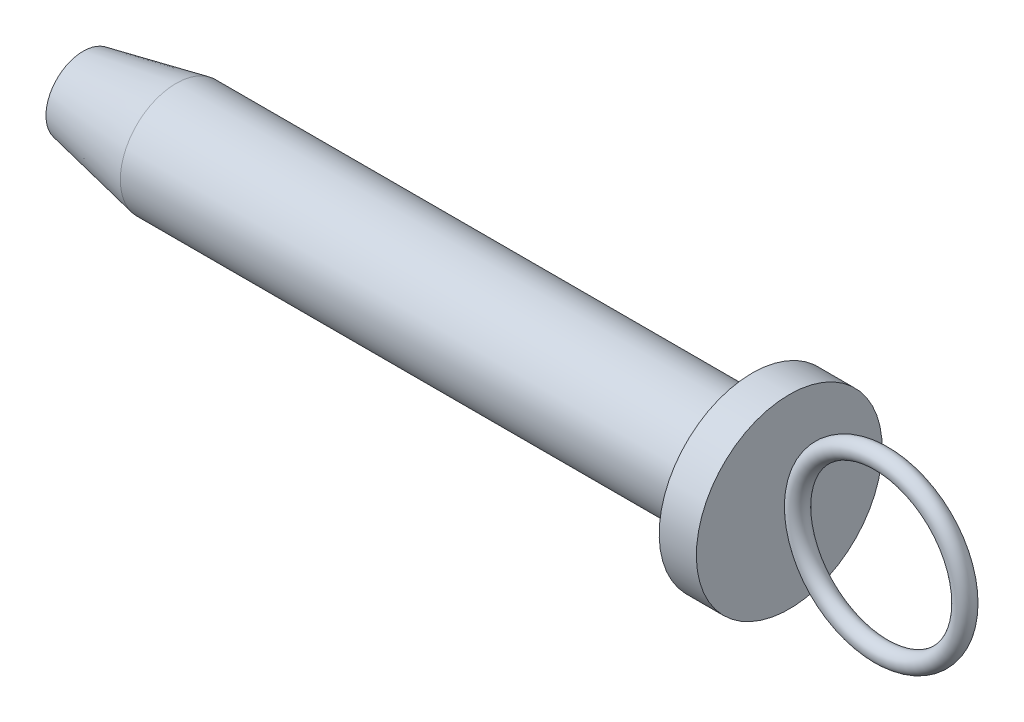
ISO-10303-21;
HEADER;
FILE_DESCRIPTION(('STEP AP214'),'2;1');
FILE_NAME('part.step','',(''),(''),'','','');
FILE_SCHEMA(('AUTOMOTIVE_DESIGN { 1 0 10303 214 1 1 1 1 }'));
ENDSEC;
DATA;
#1=APPLICATION_CONTEXT('core data for automotive mechanical design processes');
#2=APPLICATION_PROTOCOL_DEFINITION('international standard','automotive_design',2000,#1);
#3=PRODUCT_CONTEXT('',#1,'mechanical');
#4=PRODUCT('Part','Part','',(#3));
#5=PRODUCT_RELATED_PRODUCT_CATEGORY('part','',(#4));
#6=PRODUCT_DEFINITION_FORMATION('','',#4);
#7=PRODUCT_DEFINITION_CONTEXT('part definition',#1,'design');
#8=PRODUCT_DEFINITION('design','',#6,#7);
#9=PRODUCT_DEFINITION_SHAPE('','',#8);
#10=(LENGTH_UNIT() NAMED_UNIT(*) SI_UNIT(.MILLI.,.METRE.));
#11=(NAMED_UNIT(*) PLANE_ANGLE_UNIT() SI_UNIT($,.RADIAN.));
#12=(NAMED_UNIT(*) SI_UNIT($,.STERADIAN.) SOLID_ANGLE_UNIT());
#13=UNCERTAINTY_MEASURE_WITH_UNIT(LENGTH_MEASURE(1.E-05),#10,'distance_accuracy_value','');
#14=(GEOMETRIC_REPRESENTATION_CONTEXT(3) GLOBAL_UNCERTAINTY_ASSIGNED_CONTEXT((#13)) GLOBAL_UNIT_ASSIGNED_CONTEXT((#10,
#11,#12)) REPRESENTATION_CONTEXT('',''));
#15=CARTESIAN_POINT('',(0.,0.,0.));
#16=DIRECTION('',(0.,0.,1.));
#17=DIRECTION('',(1.,0.,0.));
#18=AXIS2_PLACEMENT_3D('',#15,#16,#17);
#19=CARTESIAN_POINT('',(0.,0.,0.));
#20=DIRECTION('',(1.,0.,0.));
#21=DIRECTION('',(0.,1.,0.));
#22=AXIS2_PLACEMENT_3D('',#19,#20,#21);
#23=PLANE('',#22);
#24=CARTESIAN_POINT('',(0.,0.,0.));
#25=DIRECTION('',(1.,0.,0.));
#26=DIRECTION('',(0.,1.,0.));
#27=AXIS2_PLACEMENT_3D('',#24,#25,#26);
#28=CIRCLE('',#27,50.);
#29=CARTESIAN_POINT('',(0.,50.,0.));
#30=VERTEX_POINT('',#29);
#31=EDGE_CURVE('E10',#30,#30,#28,.T.);
#32=ORIENTED_EDGE('',*,*,#31,.T.);
#33=EDGE_LOOP('',(#32));
#34=FACE_BOUND('',#33,.T.);
#35=CARTESIAN_POINT('',(0.,0.,2.17944947177033));
#36=CARTESIAN_POINT('',(0.,0.42149878183856,2.17945998659477));
#37=CARTESIAN_POINT('',(0.,0.843027722689126,2.16841904708334));
#38=CARTESIAN_POINT('',(0.,1.68536396219885,2.12318815262287));
#39=CARTESIAN_POINT('',(0.,2.10617001058888,2.08897350495459));
#40=CARTESIAN_POINT('',(0.,2.73471753888769,2.01732833882473));
#41=CARTESIAN_POINT('',(0.,2.94363657789298,1.99008700078861));
#42=CARTESIAN_POINT('',(0.,3.36031705389396,1.92791519862246));
#43=CARTESIAN_POINT('',(0.,3.56807865726714,1.89298587047071));
#44=CARTESIAN_POINT('',(0.,3.9815491142398,1.81421682686651));
#45=CARTESIAN_POINT('',(0.,4.18726089346198,1.77039260504047));
#46=CARTESIAN_POINT('',(0.,4.59603124982678,1.67187975849132));
#47=CARTESIAN_POINT('',(0.,4.79909112998843,1.61719670115698));
#48=CARTESIAN_POINT('',(0.,5.11320466515671,1.52074350807588));
#49=CARTESIAN_POINT('',(0.,5.22572640550955,1.48375706519663));
#50=CARTESIAN_POINT('',(0.,5.44895853441453,1.40443549967379));
#51=CARTESIAN_POINT('',(0.,5.55966794843453,1.36209759965095));
#52=CARTESIAN_POINT('',(0.,5.77845963931046,1.27089103021431));
#53=CARTESIAN_POINT('',(0.,5.8865405251225,1.22201898808466));
#54=CARTESIAN_POINT('',(0.,6.09854862533586,1.11606179693367));
#55=CARTESIAN_POINT('',(0.,6.20248043772922,1.05898608133228));
#56=CARTESIAN_POINT('',(0.,6.40481313003735,0.933359937281019));
#57=CARTESIAN_POINT('',(0.,6.50314189395607,0.864691897900993));
#58=CARTESIAN_POINT('',(0.,6.68726313431992,0.712402419432671));
#59=CARTESIAN_POINT('',(0.,6.77314883497989,0.628903871459761));
#60=CARTESIAN_POINT('',(0.,6.8757787162716,0.498268042379382));
#61=CARTESIAN_POINT('',(0.,6.90303278061325,0.45947898442415));
#62=CARTESIAN_POINT('',(0.,6.95214613324469,0.378547324332877));
#63=CARTESIAN_POINT('',(0.,6.97400491584688,0.336404408336449));
#64=CARTESIAN_POINT('',(0.,7.01083808281939,0.24853394838752));
#65=CARTESIAN_POINT('',(0.,7.0257268979002,0.202769523901598));
#66=CARTESIAN_POINT('',(0.,7.04645295226523,0.109246754611275));
#67=CARTESIAN_POINT('',(0.,7.05230659797149,0.061492185979087));
#68=CARTESIAN_POINT('',(0.,7.05406930243933,-0.0292543239346663));
#69=CARTESIAN_POINT('',(0.,7.0509420613236,-0.072229309776161));
#70=CARTESIAN_POINT('',(0.,7.03716162438825,-0.15695895660505));
#71=CARTESIAN_POINT('',(0.,7.02650140314884,-0.198712440508724));
#72=CARTESIAN_POINT('',(0.,6.99535927964785,-0.289871458175785));
#73=CARTESIAN_POINT('',(0.,6.97311887355608,-0.338667362862952));
#74=CARTESIAN_POINT('',(0.,6.92117709628851,-0.432083951970965));
#75=CARTESIAN_POINT('',(0.,6.89146055486769,-0.476695890687562));
#76=CARTESIAN_POINT('',(0.,6.80485532696441,-0.590572331510381));
#77=CARTESIAN_POINT('',(0.,6.74316841758978,-0.656141724988561));
#78=CARTESIAN_POINT('',(0.,6.61121393622031,-0.777885124418113));
#79=CARTESIAN_POINT('',(0.,6.54092138014418,-0.834030595690454));
#80=CARTESIAN_POINT('',(0.,6.36868536131937,-0.957917873318232));
#81=CARTESIAN_POINT('',(0.,6.26449637346105,-1.02249899099252));
#82=CARTESIAN_POINT('',(0.,6.0504723175763,-1.14166535105351));
#83=CARTESIAN_POINT('',(0.,5.94062622347301,-1.1962300476875));
#84=CARTESIAN_POINT('',(0.,5.71691063613275,-1.29782453209946));
#85=CARTESIAN_POINT('',(0.,5.60302446944741,-1.34481718787084));
#86=CARTESIAN_POINT('',(0.,5.37300224226769,-1.43248201978746));
#87=CARTESIAN_POINT('',(0.,5.25686835672187,-1.47315999292818));
#88=CARTESIAN_POINT('',(0.,4.95344797587697,-1.57200493234357));
#89=CARTESIAN_POINT('',(0.,4.76487364590706,-1.62620743035004));
#90=CARTESIAN_POINT('',(0.,4.38507011567415,-1.72448075127132));
#91=CARTESIAN_POINT('',(0.,4.19383962017605,-1.76854643305016));
#92=CARTESIAN_POINT('',(0.,3.80930747760474,-1.84841620213058));
#93=CARTESIAN_POINT('',(0.,3.61600265523733,-1.88420486609413));
#94=CARTESIAN_POINT('',(0.,3.22819781392611,-1.94865007485328));
#95=CARTESIAN_POINT('',(0.,3.03369761839277,-1.97730553860021));
#96=CARTESIAN_POINT('',(0.,2.44780338105798,-2.05406713367449));
#97=CARTESIAN_POINT('',(0.,2.05515848590833,-2.09274358527696));
#98=CARTESIAN_POINT('',(0.,1.26892169615385,-2.14903314060557));
#99=CARTESIAN_POINT('',(0.,0.875331464804734,-2.16667103490342));
#100=CARTESIAN_POINT('',(0.,0.0355100722776041,-2.18359538728171));
#101=CARTESIAN_POINT('',(0.,-0.410777411562641,-2.18013678180801));
#102=CARTESIAN_POINT('',(0.,-1.30304763369249,-2.14800165032402));
#103=CARTESIAN_POINT('',(0.,-1.74902937985356,-2.11929516613826));
#104=CARTESIAN_POINT('',(0.,-2.41467249606519,-2.05469940727802));
#105=CARTESIAN_POINT('',(0.,-2.63541038360809,-2.02967394396318));
#106=CARTESIAN_POINT('',(0.,-3.07581583397932,-1.97158676878631));
#107=CARTESIAN_POINT('',(0.,-3.29548354427478,-1.93852619803324));
#108=CARTESIAN_POINT('',(0.,-3.73286882380672,-1.86316489118027));
#109=CARTESIAN_POINT('',(0.,-3.95058901460545,-1.82087950567084));
#110=CARTESIAN_POINT('',(0.,-4.38352365652223,-1.72513406489578));
#111=CARTESIAN_POINT('',(0.,-4.5987392380628,-1.6716792750586));
#112=CARTESIAN_POINT('',(0.,-4.93242244589615,-1.57680841630995));
#113=CARTESIAN_POINT('',(0.,-5.05227430378716,-1.54026170895099));
#114=CARTESIAN_POINT('',(0.,-5.29025594647154,-1.46169632013567));
#115=CARTESIAN_POINT('',(0.,-5.40838489898437,-1.4196750855039));
#116=CARTESIAN_POINT('',(0.,-5.6422119188477,-1.32894553586474));
#117=CARTESIAN_POINT('',(0.,-5.75790737835958,-1.28023043032896));
#118=CARTESIAN_POINT('',(0.,-5.98535646460333,-1.17442480556571));
#119=CARTESIAN_POINT('',(0.,-6.09711402125455,-1.11734294769992));
#120=CARTESIAN_POINT('',(0.,-6.31534981053315,-0.991578699532659));
#121=CARTESIAN_POINT('',(0.,-6.42176976259173,-0.922794054102972));
#122=CARTESIAN_POINT('',(0.,-6.62277815714594,-0.769906612766153));
#123=CARTESIAN_POINT('',(0.,-6.71744707452865,-0.685918949242545));
#124=CARTESIAN_POINT('',(0.,-6.83259199612223,-0.554244909761135));
#125=CARTESIAN_POINT('',(0.,-6.86319645284333,-0.515510667955197));
#126=CARTESIAN_POINT('',(0.,-6.91932485823459,-0.434421020387249));
#127=CARTESIAN_POINT('',(0.,-6.94484634796394,-0.392063876101051));
#128=CARTESIAN_POINT('',(0.,-6.98928518334076,-0.303256767548711));
#129=CARTESIAN_POINT('',(0.,-7.00811546072234,-0.25676204012301));
#130=CARTESIAN_POINT('',(0.,-7.03658525286622,-0.161053281266286));
#131=CARTESIAN_POINT('',(0.,-7.04624588755985,-0.111845776224539));
#132=CARTESIAN_POINT('',(0.,-7.05458669702452,-0.01728240125677));
#133=CARTESIAN_POINT('',(0.,-7.05423613779896,0.02798715789848));
#134=CARTESIAN_POINT('',(0.,-7.04497970483613,0.117650334713045));
#135=CARTESIAN_POINT('',(0.,-7.03606695035198,0.162043218575106));
#136=CARTESIAN_POINT('',(0.,-7.00913534044537,0.254122307034996));
#137=CARTESIAN_POINT('',(0.,-6.99009808678667,0.301504089437999));
#138=CARTESIAN_POINT('',(0.,-6.94465769341792,0.392567053069191));
#139=CARTESIAN_POINT('',(0.,-6.91824161676512,0.436241557537717));
#140=CARTESIAN_POINT('',(0.,-6.84211815750932,0.545524279312061));
#141=CARTESIAN_POINT('',(0.,-6.7880843221241,0.608080577602883));
#142=CARTESIAN_POINT('',(0.,-6.67163798663171,0.724744813787047));
#143=CARTESIAN_POINT('',(0.,-6.60920237227783,0.778828521263772));
#144=CARTESIAN_POINT('',(0.,-6.45970866169796,0.89530045457902));
#145=CARTESIAN_POINT('',(0.,-6.37085872507568,0.955358435834267));
#146=CARTESIAN_POINT('',(0.,-6.18785193917911,1.06688305517149));
#147=CARTESIAN_POINT('',(0.,-6.09368529018751,1.11833308662321));
#148=CARTESIAN_POINT('',(0.,-5.90148662885084,1.21470068123799));
#149=CARTESIAN_POINT('',(0.,-5.80343695173868,1.25958261175952));
#150=CARTESIAN_POINT('',(0.,-5.60510795366906,1.34378051469834));
#151=CARTESIAN_POINT('',(0.,-5.50483061170207,1.38310121541691));
#152=CARTESIAN_POINT('',(0.,-5.24427436420939,1.47856605905192));
#153=CARTESIAN_POINT('',(0.,-5.0827593113308,1.5313265727075));
#154=CARTESIAN_POINT('',(0.,-4.75708536476196,1.62804561156496));
#155=CARTESIAN_POINT('',(0.,-4.59292514748774,1.67199957243182));
#156=CARTESIAN_POINT('',(0.,-4.26255226726789,1.75275184318911));
#157=CARTESIAN_POINT('',(0.,-4.09633641566277,1.78953699942011));
#158=CARTESIAN_POINT('',(0.,-3.76265354985,1.85695917294306));
#159=CARTESIAN_POINT('',(0.,-3.59518634810483,1.88759524870568));
#160=CARTESIAN_POINT('',(0.,-3.09173815919111,1.97146155174675));
#161=CARTESIAN_POINT('',(0.,-2.75442000828965,2.01671741415881));
#162=CARTESIAN_POINT('',(0.,-2.07833897486486,2.08987891962339));
#163=CARTESIAN_POINT('',(0.,-1.73957793284239,2.11780234154776));
#164=CARTESIAN_POINT('',(0.,-1.167276062117,2.15200686118283));
#165=CARTESIAN_POINT('',(0.,-0.933967456387854,2.16232552057151));
#166=CARTESIAN_POINT('',(0.,-0.467109010978816,2.17604453260486));
#167=CARTESIAN_POINT('',(0.,-0.233559135566106,2.17944364533994));
#168=CARTESIAN_POINT('',(0.,0.,2.17944947177033));
#169=B_SPLINE_CURVE_WITH_KNOTS('',3,(#35,#36,#37,#38,#39,#40,#41,#42,#43,#44,#45,#46,#47,#48,
#49,#50,#51,#52,#53,#54,#55,#56,#57,#58,#59,#60,#61,#62,#63,#64,#65,#66,#67,#68,#69,#70,#71,#72,
#73,#74,#75,#76,#77,#78,#79,#80,#81,#82,#83,#84,#85,#86,#87,#88,#89,#90,#91,#92,#93,#94,#95,#96,
#97,#98,#99,#100,#101,#102,#103,#104,#105,#106,#107,#108,#109,#110,#111,#112,#113,#114,#115,
#116,#117,#118,#119,#120,#121,#122,#123,#124,#125,#126,#127,#128,#129,#130,#131,#132,#133,#134,
#135,#136,#137,#138,#139,#140,#141,#142,#143,#144,#145,#146,#147,#148,#149,#150,#151,#152,#153,
#154,#155,#156,#157,#158,#159,#160,#161,#162,#163,#164,#165,#166,#167,#168),.UNSPECIFIED.,.T.,
.F.,(4,2,2,2,2,2,2,2,2,2,2,2,2,2,2,2,2,2,2,2,2,2,2,2,2,2,2,2,2,2,2,2,2,2,2,2,2,2,2,2,2,2,2,2,2,
2,2,2,2,2,2,2,2,2,2,2,2,2,2,2,2,2,2,2,2,2,4),(0.,1.26441863343538,2.5301866907775,
3.16213858340576,3.79399716136293,4.42476443491072,5.05520914148919,5.41044125196759,
5.76585848899681,6.12145989448238,6.47665561688514,6.83569929330721,7.19189592183801,
7.33378713970543,7.47569165167126,7.61929535633629,7.76263799159498,7.89119158031978,
8.01986521939751,8.1798429188074,8.3401478937655,8.60870050608162,8.8780521467,9.24491867464901,
9.61252951225128,9.98189152543646,10.3509124262644,10.939135055324,11.5276553614474,
12.1172636319069,12.7069612041785,13.8898434457294,15.071330468632,16.4095616881391,
17.749382947544,18.4157249508587,19.0819723785898,19.7471194782951,20.4119537220435,
20.787754445286,21.163731063733,21.5400919429709,21.9160659252196,22.2955117580467,
22.6721959047942,22.8199929083666,22.9678612376089,23.1175887136578,23.2669704878172,
23.4019432479989,23.537024565733,23.6893734133344,23.8419910618698,24.0885758346499,
24.3358534146157,24.6568418383956,24.9784425519177,25.3017279899105,25.6247368882881,
26.1341191362447,26.6437647120882,27.1543367826725,27.6649869710313,28.685394150744,
29.7047529034348,30.4052617359112,31.1058960811179),.UNSPECIFIED.);
#170=CARTESIAN_POINT('',(0.,0.,2.17944947177033));
#171=VERTEX_POINT('',#170);
#172=EDGE_CURVE('E36',#171,#171,#169,.T.);
#173=ORIENTED_EDGE('',*,*,#172,.T.);
#174=EDGE_LOOP('',(#173));
#175=FACE_BOUND('',#174,.T.);
#176=ADVANCED_FACE('F32',(#34,#175),#23,.T.);
#177=CARTESIAN_POINT('',(0.,0.,0.));
#178=DIRECTION('',(1.,0.,0.));
#179=DIRECTION('',(0.,1.,0.));
#180=AXIS2_PLACEMENT_3D('',#177,#178,#179);
#181=CYLINDRICAL_SURFACE('',#180,50.);
#182=CARTESIAN_POINT('',(-20.,0.,0.));
#183=DIRECTION('',(1.,0.,0.));
#184=DIRECTION('',(0.,1.,0.));
#185=AXIS2_PLACEMENT_3D('',#182,#183,#184);
#186=CIRCLE('',#185,50.);
#187=CARTESIAN_POINT('',(-20.,50.,0.));
#188=VERTEX_POINT('',#187);
#189=EDGE_CURVE('E43',#188,#188,#186,.T.);
#190=ORIENTED_EDGE('',*,*,#189,.T.);
#191=EDGE_LOOP('',(#190));
#192=FACE_BOUND('',#191,.T.);
#193=ORIENTED_EDGE('',*,*,#31,.F.);
#194=EDGE_LOOP('',(#193));
#195=FACE_BOUND('',#194,.T.);
#196=ADVANCED_FACE('F74',(#192,#195),#181,.T.);
#197=CARTESIAN_POINT('',(-20.,50.,0.));
#198=DIRECTION('',(-1.,0.,0.));
#199=DIRECTION('',(0.,-1.,0.));
#200=AXIS2_PLACEMENT_3D('',#197,#198,#199);
#201=PLANE('',#200);
#202=CARTESIAN_POINT('',(-20.,0.,0.));
#203=DIRECTION('',(1.,0.,0.));
#204=DIRECTION('',(0.,1.,0.));
#205=AXIS2_PLACEMENT_3D('',#202,#203,#204);
#206=CIRCLE('',#205,30.);
#207=CARTESIAN_POINT('',(-20.,30.,0.));
#208=VERTEX_POINT('',#207);
#209=EDGE_CURVE('E47',#208,#208,#206,.T.);
#210=ORIENTED_EDGE('',*,*,#209,.T.);
#211=EDGE_LOOP('',(#210));
#212=FACE_BOUND('',#211,.T.);
#213=ORIENTED_EDGE('',*,*,#189,.F.);
#214=EDGE_LOOP('',(#213));
#215=FACE_BOUND('',#214,.T.);
#216=ADVANCED_FACE('F78',(#212,#215),#201,.T.);
#217=CARTESIAN_POINT('',(0.,0.,0.));
#218=DIRECTION('',(1.,0.,0.));
#219=DIRECTION('',(0.,1.,0.));
#220=AXIS2_PLACEMENT_3D('',#217,#218,#219);
#221=CYLINDRICAL_SURFACE('',#220,30.);
#222=CARTESIAN_POINT('',(-330.,0.,0.));
#223=DIRECTION('',(1.,0.,0.));
#224=DIRECTION('',(0.,1.,0.));
#225=AXIS2_PLACEMENT_3D('',#222,#223,#224);
#226=CIRCLE('',#225,30.);
#227=CARTESIAN_POINT('',(-330.,30.,0.));
#228=VERTEX_POINT('',#227);
#229=EDGE_CURVE('E52',#228,#228,#226,.T.);
#230=ORIENTED_EDGE('',*,*,#229,.T.);
#231=EDGE_LOOP('',(#230));
#232=FACE_BOUND('',#231,.T.);
#233=ORIENTED_EDGE('',*,*,#209,.F.);
#234=EDGE_LOOP('',(#233));
#235=FACE_BOUND('',#234,.T.);
#236=ADVANCED_FACE('F83',(#232,#235),#221,.T.);
#237=CARTESIAN_POINT('',(-330.,0.,0.));
#238=DIRECTION('',(1.,0.,0.));
#239=DIRECTION('',(0.,1.,0.));
#240=AXIS2_PLACEMENT_3D('',#237,#238,#239);
#241=CONICAL_SURFACE('',#240,30.,0.197395559849881);
#242=CARTESIAN_POINT('',(-380.,0.,0.));
#243=DIRECTION('',(1.,0.,0.));
#244=DIRECTION('',(0.,1.,0.));
#245=AXIS2_PLACEMENT_3D('',#242,#243,#244);
#246=CIRCLE('',#245,20.);
#247=CARTESIAN_POINT('',(-380.,20.,0.));
#248=VERTEX_POINT('',#247);
#249=EDGE_CURVE('E55',#248,#248,#246,.T.);
#250=ORIENTED_EDGE('',*,*,#249,.T.);
#251=EDGE_LOOP('',(#250));
#252=FACE_BOUND('',#251,.T.);
#253=ORIENTED_EDGE('',*,*,#229,.F.);
#254=EDGE_LOOP('',(#253));
#255=FACE_BOUND('',#254,.T.);
#256=ADVANCED_FACE('F69',(#252,#255),#241,.T.);
#257=CARTESIAN_POINT('',(-380.,20.,0.));
#258=DIRECTION('',(-1.,0.,0.));
#259=DIRECTION('',(0.,-1.,0.));
#260=AXIS2_PLACEMENT_3D('',#257,#258,#259);
#261=PLANE('',#260);
#262=ORIENTED_EDGE('',*,*,#249,.F.);
#263=EDGE_LOOP('',(#262));
#264=FACE_BOUND('',#263,.T.);
#265=ADVANCED_FACE('F65',(#264),#261,.T.);
#266=CARTESIAN_POINT('',(49.5,0.,0.));
#267=DIRECTION('',(0.,0.,1.));
#268=DIRECTION('',(1.,0.,0.));
#269=AXIS2_PLACEMENT_3D('',#266,#267,#268);
#270=TOROIDAL_SURFACE('',#269,45.,5.);
#271=ORIENTED_EDGE('',*,*,#172,.F.);
#272=EDGE_LOOP('',(#271));
#273=FACE_BOUND('',#272,.T.);
#274=ADVANCED_FACE('F63',(#273),#270,.T.);
#275=CLOSED_SHELL('',(#176,#196,#216,#236,#256,#265,#274));
#276=MANIFOLD_SOLID_BREP('B2',#275);
#277=ADVANCED_BREP_SHAPE_REPRESENTATION('',(#18,#276),#14);
#278=SHAPE_DEFINITION_REPRESENTATION(#9,#277);
ENDSEC;
END-ISO-10303-21;
